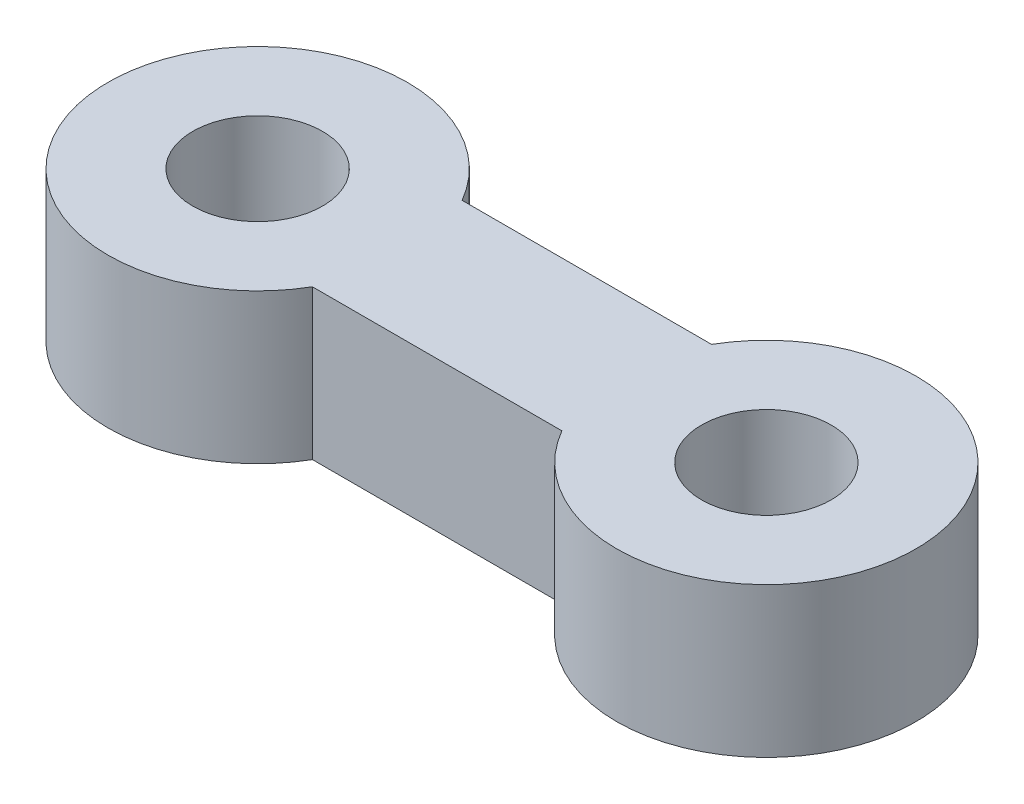
ISO-10303-21;
HEADER;
FILE_DESCRIPTION(('STEP AP214'),'2;1');
FILE_NAME('part.step','',(''),(''),'','','');
FILE_SCHEMA(('AUTOMOTIVE_DESIGN { 1 0 10303 214 1 1 1 1 }'));
ENDSEC;
DATA;
#1=APPLICATION_CONTEXT('core data for automotive mechanical design processes');
#2=APPLICATION_PROTOCOL_DEFINITION('international standard','automotive_design',2000,#1);
#3=PRODUCT_CONTEXT('',#1,'mechanical');
#4=PRODUCT('Part','Part','',(#3));
#5=PRODUCT_RELATED_PRODUCT_CATEGORY('part','',(#4));
#6=PRODUCT_DEFINITION_FORMATION('','',#4);
#7=PRODUCT_DEFINITION_CONTEXT('part definition',#1,'design');
#8=PRODUCT_DEFINITION('design','',#6,#7);
#9=PRODUCT_DEFINITION_SHAPE('','',#8);
#10=(LENGTH_UNIT() NAMED_UNIT(*) SI_UNIT(.MILLI.,.METRE.));
#11=(NAMED_UNIT(*) PLANE_ANGLE_UNIT() SI_UNIT($,.RADIAN.));
#12=(NAMED_UNIT(*) SI_UNIT($,.STERADIAN.) SOLID_ANGLE_UNIT());
#13=UNCERTAINTY_MEASURE_WITH_UNIT(LENGTH_MEASURE(1.E-05),#10,'distance_accuracy_value','');
#14=(GEOMETRIC_REPRESENTATION_CONTEXT(3) GLOBAL_UNCERTAINTY_ASSIGNED_CONTEXT((#13)) GLOBAL_UNIT_ASSIGNED_CONTEXT((#10,
#11,#12)) REPRESENTATION_CONTEXT('',''));
#15=CARTESIAN_POINT('',(0.,0.,0.));
#16=DIRECTION('',(0.,0.,1.));
#17=DIRECTION('',(1.,0.,0.));
#18=AXIS2_PLACEMENT_3D('',#15,#16,#17);
#19=CARTESIAN_POINT('',(0.,3.,0.));
#20=DIRECTION('',(0.,1.,0.));
#21=DIRECTION('',(0.,0.,1.));
#22=AXIS2_PLACEMENT_3D('',#19,#20,#21);
#23=PLANE('',#22);
#24=CARTESIAN_POINT('',(0.,3.,0.));
#25=DIRECTION('',(0.,1.,0.));
#26=DIRECTION('',(0.,0.,1.));
#27=AXIS2_PLACEMENT_3D('',#24,#25,#26);
#28=CIRCLE('',#27,1.3);
#29=CARTESIAN_POINT('',(0.,3.,1.3));
#30=VERTEX_POINT('',#29);
#31=EDGE_CURVE('E103',#30,#30,#28,.T.);
#32=ORIENTED_EDGE('',*,*,#31,.F.);
#33=EDGE_LOOP('',(#32));
#34=FACE_BOUND('',#33,.T.);
#35=CARTESIAN_POINT('',(0.,3.,0.));
#36=DIRECTION('',(0.,1.,0.));
#37=DIRECTION('',(0.,0.,1.));
#38=AXIS2_PLACEMENT_3D('',#35,#36,#37);
#39=CIRCLE('',#38,3.);
#40=CARTESIAN_POINT('',(2.59807621135332,3.,-1.5));
#41=VERTEX_POINT('',#40);
#42=CARTESIAN_POINT('',(2.59807621135332,3.,1.5));
#43=VERTEX_POINT('',#42);
#44=EDGE_CURVE('E88',#41,#43,#39,.T.);
#45=ORIENTED_EDGE('',*,*,#44,.T.);
#46=DIRECTION('',(1.,0.,0.));
#47=VECTOR('',#46,1.);
#48=CARTESIAN_POINT('',(2.59807621135332,3.,1.5));
#49=LINE('',#48,#47);
#50=CARTESIAN_POINT('',(7.59807621135331,3.,1.5));
#51=VERTEX_POINT('',#50);
#52=EDGE_CURVE('E83',#43,#51,#49,.T.);
#53=ORIENTED_EDGE('',*,*,#52,.T.);
#54=CARTESIAN_POINT('',(10.1961524227066,3.,0.));
#55=DIRECTION('',(0.,1.,0.));
#56=DIRECTION('',(0.,0.,1.));
#57=AXIS2_PLACEMENT_3D('',#54,#55,#56);
#58=CIRCLE('',#57,3.);
#59=CARTESIAN_POINT('',(7.59807621135332,3.,-1.5));
#60=VERTEX_POINT('',#59);
#61=EDGE_CURVE('E86',#51,#60,#58,.T.);
#62=ORIENTED_EDGE('',*,*,#61,.T.);
#63=DIRECTION('',(-1.,0.,0.));
#64=VECTOR('',#63,1.);
#65=CARTESIAN_POINT('',(2.59807621135332,3.,-1.5));
#66=LINE('',#65,#64);
#67=EDGE_CURVE('E53',#60,#41,#66,.T.);
#68=ORIENTED_EDGE('',*,*,#67,.T.);
#69=EDGE_LOOP('',(#45,#53,#62,#68));
#70=FACE_BOUND('',#69,.T.);
#71=CARTESIAN_POINT('',(10.1961524227066,3.,0.));
#72=DIRECTION('',(0.,1.,0.));
#73=DIRECTION('',(0.,0.,1.));
#74=AXIS2_PLACEMENT_3D('',#71,#72,#73);
#75=CIRCLE('',#74,1.3);
#76=CARTESIAN_POINT('',(10.1961524227066,3.,1.3));
#77=VERTEX_POINT('',#76);
#78=EDGE_CURVE('E118',#77,#77,#75,.T.);
#79=ORIENTED_EDGE('',*,*,#78,.F.);
#80=EDGE_LOOP('',(#79));
#81=FACE_BOUND('',#80,.T.);
#82=ADVANCED_FACE('F36',(#34,#70,#81),#23,.T.);
#83=CARTESIAN_POINT('',(0.,0.,0.));
#84=DIRECTION('',(0.,1.,0.));
#85=DIRECTION('',(0.,0.,1.));
#86=AXIS2_PLACEMENT_3D('',#83,#84,#85);
#87=PLANE('',#86);
#88=CARTESIAN_POINT('',(0.,0.,0.));
#89=DIRECTION('',(0.,1.,0.));
#90=DIRECTION('',(0.,0.,1.));
#91=AXIS2_PLACEMENT_3D('',#88,#89,#90);
#92=CIRCLE('',#91,3.);
#93=CARTESIAN_POINT('',(2.59807621135332,0.,-1.5));
#94=VERTEX_POINT('',#93);
#95=CARTESIAN_POINT('',(2.59807621135332,0.,1.5));
#96=VERTEX_POINT('',#95);
#97=EDGE_CURVE('E100',#94,#96,#92,.T.);
#98=ORIENTED_EDGE('',*,*,#97,.F.);
#99=DIRECTION('',(-1.,0.,0.));
#100=VECTOR('',#99,1.);
#101=CARTESIAN_POINT('',(2.59807621135332,0.,-1.5));
#102=LINE('',#101,#100);
#103=CARTESIAN_POINT('',(7.59807621135332,0.,-1.5));
#104=VERTEX_POINT('',#103);
#105=EDGE_CURVE('E76',#104,#94,#102,.T.);
#106=ORIENTED_EDGE('',*,*,#105,.F.);
#107=CARTESIAN_POINT('',(10.1961524227066,0.,0.));
#108=DIRECTION('',(0.,1.,0.));
#109=DIRECTION('',(0.,0.,1.));
#110=AXIS2_PLACEMENT_3D('',#107,#108,#109);
#111=CIRCLE('',#110,3.);
#112=CARTESIAN_POINT('',(7.59807621135331,0.,1.5));
#113=VERTEX_POINT('',#112);
#114=EDGE_CURVE('E70',#113,#104,#111,.T.);
#115=ORIENTED_EDGE('',*,*,#114,.F.);
#116=DIRECTION('',(1.,0.,0.));
#117=VECTOR('',#116,1.);
#118=CARTESIAN_POINT('',(2.59807621135332,0.,1.5));
#119=LINE('',#118,#117);
#120=EDGE_CURVE('E92',#96,#113,#119,.T.);
#121=ORIENTED_EDGE('',*,*,#120,.F.);
#122=EDGE_LOOP('',(#98,#106,#115,#121));
#123=FACE_BOUND('',#122,.T.);
#124=CARTESIAN_POINT('',(0.,0.,0.));
#125=DIRECTION('',(0.,1.,0.));
#126=DIRECTION('',(0.,0.,1.));
#127=AXIS2_PLACEMENT_3D('',#124,#125,#126);
#128=CIRCLE('',#127,1.3);
#129=CARTESIAN_POINT('',(0.,0.,1.3));
#130=VERTEX_POINT('',#129);
#131=EDGE_CURVE('E115',#130,#130,#128,.T.);
#132=ORIENTED_EDGE('',*,*,#131,.T.);
#133=EDGE_LOOP('',(#132));
#134=FACE_BOUND('',#133,.T.);
#135=CARTESIAN_POINT('',(10.1961524227066,0.,0.));
#136=DIRECTION('',(0.,1.,0.));
#137=DIRECTION('',(0.,0.,1.));
#138=AXIS2_PLACEMENT_3D('',#135,#136,#137);
#139=CIRCLE('',#138,1.3);
#140=CARTESIAN_POINT('',(10.1961524227066,0.,1.3));
#141=VERTEX_POINT('',#140);
#142=EDGE_CURVE('E121',#141,#141,#139,.T.);
#143=ORIENTED_EDGE('',*,*,#142,.T.);
#144=EDGE_LOOP('',(#143));
#145=FACE_BOUND('',#144,.T.);
#146=ADVANCED_FACE('F111',(#123,#134,#145),#87,.F.);
#147=CARTESIAN_POINT('',(0.,3.,0.));
#148=DIRECTION('',(0.,-1.,0.));
#149=DIRECTION('',(0.,0.,-1.));
#150=AXIS2_PLACEMENT_3D('',#147,#148,#149);
#151=CYLINDRICAL_SURFACE('',#150,3.);
#152=ORIENTED_EDGE('',*,*,#97,.T.);
#153=DIRECTION('',(0.,-1.,0.));
#154=VECTOR('',#153,1.);
#155=CARTESIAN_POINT('',(2.59807621135332,3.,1.5));
#156=LINE('',#155,#154);
#157=EDGE_CURVE('E11',#43,#96,#156,.T.);
#158=ORIENTED_EDGE('',*,*,#157,.F.);
#159=ORIENTED_EDGE('',*,*,#44,.F.);
#160=DIRECTION('',(0.,-1.,0.));
#161=VECTOR('',#160,1.);
#162=CARTESIAN_POINT('',(2.59807621135332,3.,-1.5));
#163=LINE('',#162,#161);
#164=EDGE_CURVE('E96',#41,#94,#163,.T.);
#165=ORIENTED_EDGE('',*,*,#164,.T.);
#166=EDGE_LOOP('',(#152,#158,#159,#165));
#167=FACE_BOUND('',#166,.T.);
#168=ADVANCED_FACE('F38',(#167),#151,.T.);
#169=CARTESIAN_POINT('',(2.59807621135332,3.,1.5));
#170=DIRECTION('',(0.,0.,-1.));
#171=DIRECTION('',(-1.,0.,0.));
#172=AXIS2_PLACEMENT_3D('',#169,#170,#171);
#173=PLANE('',#172);
#174=ORIENTED_EDGE('',*,*,#120,.T.);
#175=DIRECTION('',(0.,-1.,0.));
#176=VECTOR('',#175,1.);
#177=CARTESIAN_POINT('',(7.59807621135331,3.,1.5));
#178=LINE('',#177,#176);
#179=EDGE_CURVE('E45',#51,#113,#178,.T.);
#180=ORIENTED_EDGE('',*,*,#179,.F.);
#181=ORIENTED_EDGE('',*,*,#52,.F.);
#182=ORIENTED_EDGE('',*,*,#157,.T.);
#183=EDGE_LOOP('',(#174,#180,#181,#182));
#184=FACE_BOUND('',#183,.T.);
#185=ADVANCED_FACE('F91',(#184),#173,.F.);
#186=CARTESIAN_POINT('',(10.1961524227066,3.,0.));
#187=DIRECTION('',(0.,-1.,0.));
#188=DIRECTION('',(0.,0.,-1.));
#189=AXIS2_PLACEMENT_3D('',#186,#187,#188);
#190=CYLINDRICAL_SURFACE('',#189,3.);
#191=ORIENTED_EDGE('',*,*,#114,.T.);
#192=DIRECTION('',(0.,-1.,0.));
#193=VECTOR('',#192,1.);
#194=CARTESIAN_POINT('',(7.59807621135332,3.,-1.5));
#195=LINE('',#194,#193);
#196=EDGE_CURVE('E93',#60,#104,#195,.T.);
#197=ORIENTED_EDGE('',*,*,#196,.F.);
#198=ORIENTED_EDGE('',*,*,#61,.F.);
#199=ORIENTED_EDGE('',*,*,#179,.T.);
#200=EDGE_LOOP('',(#191,#197,#198,#199));
#201=FACE_BOUND('',#200,.T.);
#202=ADVANCED_FACE('F94',(#201),#190,.T.);
#203=CARTESIAN_POINT('',(2.59807621135332,3.,-1.5));
#204=DIRECTION('',(0.,0.,1.));
#205=DIRECTION('',(1.,0.,0.));
#206=AXIS2_PLACEMENT_3D('',#203,#204,#205);
#207=PLANE('',#206);
#208=ORIENTED_EDGE('',*,*,#105,.T.);
#209=ORIENTED_EDGE('',*,*,#164,.F.);
#210=ORIENTED_EDGE('',*,*,#67,.F.);
#211=ORIENTED_EDGE('',*,*,#196,.T.);
#212=EDGE_LOOP('',(#208,#209,#210,#211));
#213=FACE_BOUND('',#212,.T.);
#214=ADVANCED_FACE('F108',(#213),#207,.F.);
#215=CARTESIAN_POINT('',(0.,3.,0.));
#216=DIRECTION('',(0.,-1.,0.));
#217=DIRECTION('',(0.,0.,-1.));
#218=AXIS2_PLACEMENT_3D('',#215,#216,#217);
#219=CYLINDRICAL_SURFACE('',#218,1.3);
#220=ORIENTED_EDGE('',*,*,#31,.T.);
#221=EDGE_LOOP('',(#220));
#222=FACE_BOUND('',#221,.T.);
#223=ORIENTED_EDGE('',*,*,#131,.F.);
#224=EDGE_LOOP('',(#223));
#225=FACE_BOUND('',#224,.T.);
#226=ADVANCED_FACE('F138',(#222,#225),#219,.F.);
#227=CARTESIAN_POINT('',(10.1961524227066,3.,0.));
#228=DIRECTION('',(0.,-1.,0.));
#229=DIRECTION('',(0.,0.,-1.));
#230=AXIS2_PLACEMENT_3D('',#227,#228,#229);
#231=CYLINDRICAL_SURFACE('',#230,1.3);
#232=ORIENTED_EDGE('',*,*,#78,.T.);
#233=EDGE_LOOP('',(#232));
#234=FACE_BOUND('',#233,.T.);
#235=ORIENTED_EDGE('',*,*,#142,.F.);
#236=EDGE_LOOP('',(#235));
#237=FACE_BOUND('',#236,.T.);
#238=ADVANCED_FACE('F127',(#234,#237),#231,.F.);
#239=CLOSED_SHELL('',(#82,#146,#168,#185,#202,#214,#226,#238));
#240=MANIFOLD_SOLID_BREP('B2',#239);
#241=ADVANCED_BREP_SHAPE_REPRESENTATION('',(#18,#240),#14);
#242=SHAPE_DEFINITION_REPRESENTATION(#9,#241);
ENDSEC;
END-ISO-10303-21;
